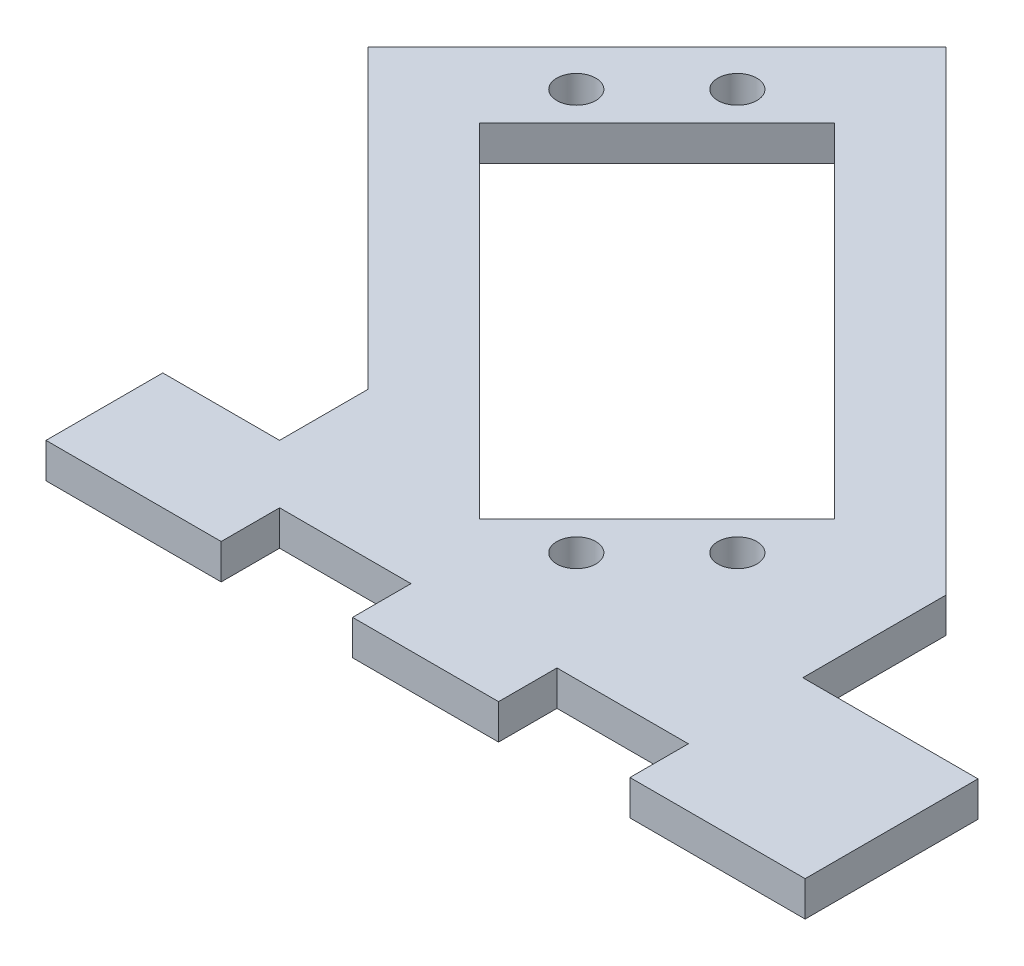
ISO-10303-21;
HEADER;
FILE_DESCRIPTION(('STEP AP214'),'2;1');
FILE_NAME('part.step','',(''),(''),'','','');
FILE_SCHEMA(('AUTOMOTIVE_DESIGN { 1 0 10303 214 1 1 1 1 }'));
ENDSEC;
DATA;
#1=APPLICATION_CONTEXT('core data for automotive mechanical design processes');
#2=APPLICATION_PROTOCOL_DEFINITION('international standard','automotive_design',2000,#1);
#3=PRODUCT_CONTEXT('',#1,'mechanical');
#4=PRODUCT('Part','Part','',(#3));
#5=PRODUCT_RELATED_PRODUCT_CATEGORY('part','',(#4));
#6=PRODUCT_DEFINITION_FORMATION('','',#4);
#7=PRODUCT_DEFINITION_CONTEXT('part definition',#1,'design');
#8=PRODUCT_DEFINITION('design','',#6,#7);
#9=PRODUCT_DEFINITION_SHAPE('','',#8);
#10=(LENGTH_UNIT() NAMED_UNIT(*) SI_UNIT(.MILLI.,.METRE.));
#11=(NAMED_UNIT(*) PLANE_ANGLE_UNIT() SI_UNIT($,.RADIAN.));
#12=(NAMED_UNIT(*) SI_UNIT($,.STERADIAN.) SOLID_ANGLE_UNIT());
#13=UNCERTAINTY_MEASURE_WITH_UNIT(LENGTH_MEASURE(1.E-05),#10,'distance_accuracy_value','');
#14=(GEOMETRIC_REPRESENTATION_CONTEXT(3) GLOBAL_UNCERTAINTY_ASSIGNED_CONTEXT((#13)) GLOBAL_UNIT_ASSIGNED_CONTEXT((#10,
#11,#12)) REPRESENTATION_CONTEXT('',''));
#15=CARTESIAN_POINT('',(0.,0.,0.));
#16=DIRECTION('',(0.,0.,1.));
#17=DIRECTION('',(1.,0.,0.));
#18=AXIS2_PLACEMENT_3D('',#15,#16,#17);
#19=CARTESIAN_POINT('',(0.,3.,0.));
#20=DIRECTION('',(0.,1.,0.));
#21=DIRECTION('',(0.,0.,1.));
#22=AXIS2_PLACEMENT_3D('',#19,#20,#21);
#23=PLANE('',#22);
#24=CARTESIAN_POINT('',(6.66448141268325,3.,-1.64402326625868));
#25=DIRECTION('',(0.,1.,0.));
#26=DIRECTION('',(0.,0.,1.));
#27=AXIS2_PLACEMENT_3D('',#24,#25,#26);
#28=CIRCLE('',#27,1.67019483414993);
#29=CARTESIAN_POINT('',(6.66448141268325,3.,0.0261715678912522));
#30=VERTEX_POINT('',#29);
#31=EDGE_CURVE('E755',#30,#30,#28,.T.);
#32=ORIENTED_EDGE('',*,*,#31,.F.);
#33=EDGE_LOOP('',(#32));
#34=FACE_BOUND('',#33,.T.);
#35=CARTESIAN_POINT('',(-20.8066170364141,3.,-42.9037039484938));
#36=DIRECTION('',(0.,1.,0.));
#37=DIRECTION('',(0.,0.,1.));
#38=AXIS2_PLACEMENT_3D('',#35,#36,#37);
#39=CIRCLE('',#38,1.67019483414992);
#40=CARTESIAN_POINT('',(-20.8066170364141,3.,-41.2335091143438));
#41=VERTEX_POINT('',#40);
#42=EDGE_CURVE('E224',#41,#41,#39,.T.);
#43=ORIENTED_EDGE('',*,*,#42,.F.);
#44=EDGE_LOOP('',(#43));
#45=FACE_BOUND('',#44,.T.);
#46=DIRECTION('',(-0.707106781186547,0.,-0.707106781186549));
#47=VECTOR('',#46,1.);
#48=CARTESIAN_POINT('',(-15.0260191002141,3.,-54.9775522372541));
#49=LINE('',#48,#47);
#50=CARTESIAN_POINT('',(25.6239808997858,3.,-14.3275522372541));
#51=VERTEX_POINT('',#50);
#52=CARTESIAN_POINT('',(-15.0260191002141,3.,-54.9775522372541));
#53=VERTEX_POINT('',#52);
#54=EDGE_CURVE('E240',#51,#53,#49,.T.);
#55=ORIENTED_EDGE('',*,*,#54,.T.);
#56=DIRECTION('',(-0.707106781186551,0.,0.707106781186544));
#57=VECTOR('',#56,1.);
#58=CARTESIAN_POINT('',(-39.7747564417434,3.,-30.228814895725));
#59=LINE('',#58,#57);
#60=CARTESIAN_POINT('',(-39.7747564417434,3.,-30.228814895725));
#61=VERTEX_POINT('',#60);
#62=EDGE_CURVE('E244',#53,#61,#59,.T.);
#63=ORIENTED_EDGE('',*,*,#62,.T.);
#64=DIRECTION('',(0.707106781186546,0.,0.707106781186548));
#65=VECTOR('',#64,1.);
#66=CARTESIAN_POINT('',(-14.3760191002142,3.,-4.8300775541958));
#67=LINE('',#66,#65);
#68=CARTESIAN_POINT('',(-14.3760191002142,3.,-4.8300775541958));
#69=VERTEX_POINT('',#68);
#70=EDGE_CURVE('E248',#61,#69,#67,.T.);
#71=ORIENTED_EDGE('',*,*,#70,.T.);
#72=DIRECTION('',(0.,0.,1.));
#73=VECTOR('',#72,1.);
#74=CARTESIAN_POINT('',(-14.3760191002142,3.,-4.8300775541958));
#75=LINE('',#74,#73);
#76=CARTESIAN_POINT('',(-14.3760191002142,3.,2.7224477627459));
#77=VERTEX_POINT('',#76);
#78=EDGE_CURVE('E251',#69,#77,#75,.T.);
#79=ORIENTED_EDGE('',*,*,#78,.T.);
#80=DIRECTION('',(-1.,0.,0.));
#81=VECTOR('',#80,1.);
#82=CARTESIAN_POINT('',(-14.3760191002142,3.,2.7224477627459));
#83=LINE('',#82,#81);
#84=CARTESIAN_POINT('',(-24.3760191002142,3.,2.7224477627459));
#85=VERTEX_POINT('',#84);
#86=EDGE_CURVE('E254',#77,#85,#83,.T.);
#87=ORIENTED_EDGE('',*,*,#86,.T.);
#88=DIRECTION('',(0.,0.,1.));
#89=VECTOR('',#88,1.);
#90=CARTESIAN_POINT('',(-24.3760191002142,3.,2.7224477627459));
#91=LINE('',#90,#89);
#92=CARTESIAN_POINT('',(-24.3760191002142,3.,12.7224477627459));
#93=VERTEX_POINT('',#92);
#94=EDGE_CURVE('E257',#85,#93,#91,.T.);
#95=ORIENTED_EDGE('',*,*,#94,.T.);
#96=DIRECTION('',(1.,0.,0.));
#97=VECTOR('',#96,1.);
#98=CARTESIAN_POINT('',(-24.3760191002142,3.,12.7224477627459));
#99=LINE('',#98,#97);
#100=CARTESIAN_POINT('',(-9.3760191002142,3.,12.7224477627459));
#101=VERTEX_POINT('',#100);
#102=EDGE_CURVE('E260',#93,#101,#99,.T.);
#103=ORIENTED_EDGE('',*,*,#102,.T.);
#104=DIRECTION('',(0.,0.,-1.));
#105=VECTOR('',#104,1.);
#106=CARTESIAN_POINT('',(-9.3760191002142,3.,12.7224477627459));
#107=LINE('',#106,#105);
#108=CARTESIAN_POINT('',(-9.3760191002142,3.,7.7224477627459));
#109=VERTEX_POINT('',#108);
#110=EDGE_CURVE('E263',#101,#109,#107,.T.);
#111=ORIENTED_EDGE('',*,*,#110,.T.);
#112=DIRECTION('',(1.,0.,0.));
#113=VECTOR('',#112,1.);
#114=CARTESIAN_POINT('',(-9.3760191002142,3.,7.7224477627459));
#115=LINE('',#114,#113);
#116=CARTESIAN_POINT('',(1.87398089978579,3.,7.7224477627459));
#117=VERTEX_POINT('',#116);
#118=EDGE_CURVE('E266',#109,#117,#115,.T.);
#119=ORIENTED_EDGE('',*,*,#118,.T.);
#120=DIRECTION('',(0.,0.,1.));
#121=VECTOR('',#120,1.);
#122=CARTESIAN_POINT('',(1.87398089978579,3.,7.7224477627459));
#123=LINE('',#122,#121);
#124=CARTESIAN_POINT('',(1.87398089978579,3.,12.7224477627459));
#125=VERTEX_POINT('',#124);
#126=EDGE_CURVE('E269',#117,#125,#123,.T.);
#127=ORIENTED_EDGE('',*,*,#126,.T.);
#128=DIRECTION('',(1.,0.,0.));
#129=VECTOR('',#128,1.);
#130=CARTESIAN_POINT('',(1.87398089978579,3.,12.7224477627459));
#131=LINE('',#130,#129);
#132=CARTESIAN_POINT('',(14.3739808997858,3.,12.7224477627459));
#133=VERTEX_POINT('',#132);
#134=EDGE_CURVE('E272',#125,#133,#131,.T.);
#135=ORIENTED_EDGE('',*,*,#134,.T.);
#136=DIRECTION('',(0.,0.,-1.));
#137=VECTOR('',#136,1.);
#138=CARTESIAN_POINT('',(14.3739808997858,3.,12.7224477627459));
#139=LINE('',#138,#137);
#140=CARTESIAN_POINT('',(14.3739808997858,3.,7.7224477627459));
#141=VERTEX_POINT('',#140);
#142=EDGE_CURVE('E275',#133,#141,#139,.T.);
#143=ORIENTED_EDGE('',*,*,#142,.T.);
#144=DIRECTION('',(1.,0.,0.));
#145=VECTOR('',#144,1.);
#146=CARTESIAN_POINT('',(14.3739808997858,3.,7.7224477627459));
#147=LINE('',#146,#145);
#148=CARTESIAN_POINT('',(25.6239808997858,3.,7.7224477627459));
#149=VERTEX_POINT('',#148);
#150=EDGE_CURVE('E278',#141,#149,#147,.T.);
#151=ORIENTED_EDGE('',*,*,#150,.T.);
#152=DIRECTION('',(0.,0.,1.));
#153=VECTOR('',#152,1.);
#154=CARTESIAN_POINT('',(25.6239808997858,3.,7.7224477627459));
#155=LINE('',#154,#153);
#156=CARTESIAN_POINT('',(25.6239808997858,3.,12.7224477627459));
#157=VERTEX_POINT('',#156);
#158=EDGE_CURVE('E281',#149,#157,#155,.T.);
#159=ORIENTED_EDGE('',*,*,#158,.T.);
#160=DIRECTION('',(1.,0.,0.));
#161=VECTOR('',#160,1.);
#162=CARTESIAN_POINT('',(25.6239808997858,3.,12.7224477627459));
#163=LINE('',#162,#161);
#164=CARTESIAN_POINT('',(40.6239808997858,3.,12.7224477627459));
#165=VERTEX_POINT('',#164);
#166=EDGE_CURVE('E284',#157,#165,#163,.T.);
#167=ORIENTED_EDGE('',*,*,#166,.T.);
#168=DIRECTION('',(0.,0.,-1.));
#169=VECTOR('',#168,1.);
#170=CARTESIAN_POINT('',(40.6239808997858,3.,12.7224477627459));
#171=LINE('',#170,#169);
#172=CARTESIAN_POINT('',(40.6239808997858,3.,-2.07755223725413));
#173=VERTEX_POINT('',#172);
#174=EDGE_CURVE('E287',#165,#173,#171,.T.);
#175=ORIENTED_EDGE('',*,*,#174,.T.);
#176=DIRECTION('',(-1.,0.,0.));
#177=VECTOR('',#176,1.);
#178=CARTESIAN_POINT('',(25.6239808997858,3.,-2.07755223725411));
#179=LINE('',#178,#177);
#180=CARTESIAN_POINT('',(25.6239808997858,3.,-2.07755223725411));
#181=VERTEX_POINT('',#180);
#182=EDGE_CURVE('E290',#173,#181,#179,.T.);
#183=ORIENTED_EDGE('',*,*,#182,.T.);
#184=DIRECTION('',(0.,0.,-1.));
#185=VECTOR('',#184,1.);
#186=CARTESIAN_POINT('',(25.6239808997858,3.,-14.3275522372541));
#187=LINE('',#186,#185);
#188=EDGE_CURVE('E293',#181,#51,#187,.T.);
#189=ORIENTED_EDGE('',*,*,#188,.T.);
#190=EDGE_LOOP('',(#55,#63,#71,#79,#87,#95,#103,#111,#119,#127,#135,#143,#151,#159,#167,#175,
#183,#189));
#191=FACE_BOUND('',#190,.T.);
#192=DIRECTION('',(0.707106781186549,0.,-0.707106781186546));
#193=VECTOR('',#192,1.);
#194=CARTESIAN_POINT('',(0.,3.,0.));
#195=LINE('',#194,#193);
#196=CARTESIAN_POINT('',(0.,3.,0.));
#197=VERTEX_POINT('',#196);
#198=CARTESIAN_POINT('',(15.2027957955108,3.,-15.2027957955108));
#199=VERTEX_POINT('',#198);
#200=EDGE_CURVE('E198',#197,#199,#195,.T.);
#201=ORIENTED_EDGE('',*,*,#200,.F.);
#202=DIRECTION('',(0.707106781186546,0.,0.707106781186549));
#203=VECTOR('',#202,1.);
#204=CARTESIAN_POINT('',(-29.3449314192418,3.,-29.3449314192419));
#205=LINE('',#204,#203);
#206=CARTESIAN_POINT('',(-29.3449314192418,3.,-29.3449314192419));
#207=VERTEX_POINT('',#206);
#208=EDGE_CURVE('E189',#207,#197,#205,.T.);
#209=ORIENTED_EDGE('',*,*,#208,.F.);
#210=DIRECTION('',(-0.707106781186552,0.,0.707106781186543));
#211=VECTOR('',#210,1.);
#212=CARTESIAN_POINT('',(-14.1421356237311,3.,-44.5477272147525));
#213=LINE('',#212,#211);
#214=CARTESIAN_POINT('',(-14.1421356237311,3.,-44.5477272147525));
#215=VERTEX_POINT('',#214);
#216=EDGE_CURVE('E216',#215,#207,#213,.T.);
#217=ORIENTED_EDGE('',*,*,#216,.F.);
#218=DIRECTION('',(-0.707106781186549,0.,-0.707106781186547));
#219=VECTOR('',#218,1.);
#220=CARTESIAN_POINT('',(15.2027957955108,3.,-15.2027957955108));
#221=LINE('',#220,#219);
#222=EDGE_CURVE('E212',#199,#215,#221,.T.);
#223=ORIENTED_EDGE('',*,*,#222,.F.);
#224=EDGE_LOOP('',(#201,#209,#217,#223));
#225=FACE_BOUND('',#224,.T.);
#226=CARTESIAN_POINT('',(-27.7009081529829,3.,-36.0094128319249));
#227=DIRECTION('',(0.,1.,0.));
#228=DIRECTION('',(0.,0.,-1.));
#229=AXIS2_PLACEMENT_3D('',#226,#227,#228);
#230=CIRCLE('',#229,1.67019483414993);
#231=CARTESIAN_POINT('',(-27.7009081529829,3.,-37.6796076660749));
#232=VERTEX_POINT('',#231);
#233=EDGE_CURVE('E763',#232,#232,#230,.T.);
#234=ORIENTED_EDGE('',*,*,#233,.F.);
#235=EDGE_LOOP('',(#234));
#236=FACE_BOUND('',#235,.T.);
#237=CARTESIAN_POINT('',(13.5587725292521,3.,-8.5383143828275));
#238=DIRECTION('',(0.,1.,0.));
#239=DIRECTION('',(0.,0.,-1.));
#240=AXIS2_PLACEMENT_3D('',#237,#238,#239);
#241=CIRCLE('',#240,1.67019483414992);
#242=CARTESIAN_POINT('',(13.5587725292521,3.,-10.2085092169774));
#243=VERTEX_POINT('',#242);
#244=EDGE_CURVE('E744',#243,#243,#241,.T.);
#245=ORIENTED_EDGE('',*,*,#244,.F.);
#246=EDGE_LOOP('',(#245));
#247=FACE_BOUND('',#246,.T.);
#248=ADVANCED_FACE('F39',(#34,#45,#191,#225,#236,#247),#23,.T.);
#249=CARTESIAN_POINT('',(0.,0.,0.));
#250=DIRECTION('',(0.,1.,0.));
#251=DIRECTION('',(0.,0.,1.));
#252=AXIS2_PLACEMENT_3D('',#249,#250,#251);
#253=PLANE('',#252);
#254=DIRECTION('',(-0.707106781186547,0.,-0.707106781186549));
#255=VECTOR('',#254,1.);
#256=CARTESIAN_POINT('',(-15.0260191002141,0.,-54.9775522372541));
#257=LINE('',#256,#255);
#258=CARTESIAN_POINT('',(25.6239808997858,0.,-14.3275522372541));
#259=VERTEX_POINT('',#258);
#260=CARTESIAN_POINT('',(-15.0260191002141,0.,-54.9775522372541));
#261=VERTEX_POINT('',#260);
#262=EDGE_CURVE('E207',#259,#261,#257,.T.);
#263=ORIENTED_EDGE('',*,*,#262,.F.);
#264=DIRECTION('',(0.,0.,-1.));
#265=VECTOR('',#264,1.);
#266=CARTESIAN_POINT('',(25.6239808997858,0.,-14.3275522372541));
#267=LINE('',#266,#265);
#268=CARTESIAN_POINT('',(25.6239808997858,0.,-2.07755223725411));
#269=VERTEX_POINT('',#268);
#270=EDGE_CURVE('E245',#269,#259,#267,.T.);
#271=ORIENTED_EDGE('',*,*,#270,.F.);
#272=DIRECTION('',(-1.,0.,0.));
#273=VECTOR('',#272,1.);
#274=CARTESIAN_POINT('',(25.6239808997858,0.,-2.07755223725411));
#275=LINE('',#274,#273);
#276=CARTESIAN_POINT('',(40.6239808997858,0.,-2.07755223725413));
#277=VERTEX_POINT('',#276);
#278=EDGE_CURVE('E345',#277,#269,#275,.T.);
#279=ORIENTED_EDGE('',*,*,#278,.F.);
#280=DIRECTION('',(0.,0.,-1.));
#281=VECTOR('',#280,1.);
#282=CARTESIAN_POINT('',(40.6239808997858,0.,12.7224477627459));
#283=LINE('',#282,#281);
#284=CARTESIAN_POINT('',(40.6239808997858,0.,12.7224477627459));
#285=VERTEX_POINT('',#284);
#286=EDGE_CURVE('E342',#285,#277,#283,.T.);
#287=ORIENTED_EDGE('',*,*,#286,.F.);
#288=DIRECTION('',(1.,0.,0.));
#289=VECTOR('',#288,1.);
#290=CARTESIAN_POINT('',(25.6239808997858,0.,12.7224477627459));
#291=LINE('',#290,#289);
#292=CARTESIAN_POINT('',(25.6239808997858,0.,12.7224477627459));
#293=VERTEX_POINT('',#292);
#294=EDGE_CURVE('E339',#293,#285,#291,.T.);
#295=ORIENTED_EDGE('',*,*,#294,.F.);
#296=DIRECTION('',(0.,0.,1.));
#297=VECTOR('',#296,1.);
#298=CARTESIAN_POINT('',(25.6239808997858,0.,7.7224477627459));
#299=LINE('',#298,#297);
#300=CARTESIAN_POINT('',(25.6239808997858,0.,7.7224477627459));
#301=VERTEX_POINT('',#300);
#302=EDGE_CURVE('E336',#301,#293,#299,.T.);
#303=ORIENTED_EDGE('',*,*,#302,.F.);
#304=DIRECTION('',(1.,0.,0.));
#305=VECTOR('',#304,1.);
#306=CARTESIAN_POINT('',(14.3739808997858,0.,7.7224477627459));
#307=LINE('',#306,#305);
#308=CARTESIAN_POINT('',(14.3739808997858,0.,7.7224477627459));
#309=VERTEX_POINT('',#308);
#310=EDGE_CURVE('E333',#309,#301,#307,.T.);
#311=ORIENTED_EDGE('',*,*,#310,.F.);
#312=DIRECTION('',(0.,0.,-1.));
#313=VECTOR('',#312,1.);
#314=CARTESIAN_POINT('',(14.3739808997858,0.,12.7224477627459));
#315=LINE('',#314,#313);
#316=CARTESIAN_POINT('',(14.3739808997858,0.,12.7224477627459));
#317=VERTEX_POINT('',#316);
#318=EDGE_CURVE('E330',#317,#309,#315,.T.);
#319=ORIENTED_EDGE('',*,*,#318,.F.);
#320=DIRECTION('',(1.,0.,0.));
#321=VECTOR('',#320,1.);
#322=CARTESIAN_POINT('',(1.87398089978579,0.,12.7224477627459));
#323=LINE('',#322,#321);
#324=CARTESIAN_POINT('',(1.87398089978579,0.,12.7224477627459));
#325=VERTEX_POINT('',#324);
#326=EDGE_CURVE('E327',#325,#317,#323,.T.);
#327=ORIENTED_EDGE('',*,*,#326,.F.);
#328=DIRECTION('',(0.,0.,1.));
#329=VECTOR('',#328,1.);
#330=CARTESIAN_POINT('',(1.87398089978579,0.,7.7224477627459));
#331=LINE('',#330,#329);
#332=CARTESIAN_POINT('',(1.87398089978579,0.,7.7224477627459));
#333=VERTEX_POINT('',#332);
#334=EDGE_CURVE('E324',#333,#325,#331,.T.);
#335=ORIENTED_EDGE('',*,*,#334,.F.);
#336=DIRECTION('',(1.,0.,0.));
#337=VECTOR('',#336,1.);
#338=CARTESIAN_POINT('',(-9.3760191002142,0.,7.7224477627459));
#339=LINE('',#338,#337);
#340=CARTESIAN_POINT('',(-9.3760191002142,0.,7.7224477627459));
#341=VERTEX_POINT('',#340);
#342=EDGE_CURVE('E321',#341,#333,#339,.T.);
#343=ORIENTED_EDGE('',*,*,#342,.F.);
#344=DIRECTION('',(0.,0.,-1.));
#345=VECTOR('',#344,1.);
#346=CARTESIAN_POINT('',(-9.3760191002142,0.,12.7224477627459));
#347=LINE('',#346,#345);
#348=CARTESIAN_POINT('',(-9.3760191002142,0.,12.7224477627459));
#349=VERTEX_POINT('',#348);
#350=EDGE_CURVE('E318',#349,#341,#347,.T.);
#351=ORIENTED_EDGE('',*,*,#350,.F.);
#352=DIRECTION('',(1.,0.,0.));
#353=VECTOR('',#352,1.);
#354=CARTESIAN_POINT('',(-24.3760191002142,0.,12.7224477627459));
#355=LINE('',#354,#353);
#356=CARTESIAN_POINT('',(-24.3760191002142,0.,12.7224477627459));
#357=VERTEX_POINT('',#356);
#358=EDGE_CURVE('E315',#357,#349,#355,.T.);
#359=ORIENTED_EDGE('',*,*,#358,.F.);
#360=DIRECTION('',(0.,0.,1.));
#361=VECTOR('',#360,1.);
#362=CARTESIAN_POINT('',(-24.3760191002142,0.,2.7224477627459));
#363=LINE('',#362,#361);
#364=CARTESIAN_POINT('',(-24.3760191002142,0.,2.7224477627459));
#365=VERTEX_POINT('',#364);
#366=EDGE_CURVE('E312',#365,#357,#363,.T.);
#367=ORIENTED_EDGE('',*,*,#366,.F.);
#368=DIRECTION('',(-1.,0.,0.));
#369=VECTOR('',#368,1.);
#370=CARTESIAN_POINT('',(-14.3760191002142,0.,2.7224477627459));
#371=LINE('',#370,#369);
#372=CARTESIAN_POINT('',(-14.3760191002142,0.,2.7224477627459));
#373=VERTEX_POINT('',#372);
#374=EDGE_CURVE('E309',#373,#365,#371,.T.);
#375=ORIENTED_EDGE('',*,*,#374,.F.);
#376=DIRECTION('',(0.,0.,1.));
#377=VECTOR('',#376,1.);
#378=CARTESIAN_POINT('',(-14.3760191002142,0.,-4.8300775541958));
#379=LINE('',#378,#377);
#380=CARTESIAN_POINT('',(-14.3760191002142,0.,-4.8300775541958));
#381=VERTEX_POINT('',#380);
#382=EDGE_CURVE('E306',#381,#373,#379,.T.);
#383=ORIENTED_EDGE('',*,*,#382,.F.);
#384=DIRECTION('',(0.707106781186546,0.,0.707106781186548));
#385=VECTOR('',#384,1.);
#386=CARTESIAN_POINT('',(-14.3760191002142,0.,-4.8300775541958));
#387=LINE('',#386,#385);
#388=CARTESIAN_POINT('',(-39.7747564417434,0.,-30.228814895725));
#389=VERTEX_POINT('',#388);
#390=EDGE_CURVE('E303',#389,#381,#387,.T.);
#391=ORIENTED_EDGE('',*,*,#390,.F.);
#392=DIRECTION('',(-0.707106781186551,0.,0.707106781186544));
#393=VECTOR('',#392,1.);
#394=CARTESIAN_POINT('',(-39.7747564417434,0.,-30.228814895725));
#395=LINE('',#394,#393);
#396=EDGE_CURVE('E300',#261,#389,#395,.T.);
#397=ORIENTED_EDGE('',*,*,#396,.F.);
#398=EDGE_LOOP('',(#263,#271,#279,#287,#295,#303,#311,#319,#327,#335,#343,#351,#359,#367,#375,
#383,#391,#397));
#399=FACE_BOUND('',#398,.T.);
#400=DIRECTION('',(0.707106781186546,0.,0.707106781186549));
#401=VECTOR('',#400,1.);
#402=CARTESIAN_POINT('',(-29.3449314192418,0.,-29.3449314192419));
#403=LINE('',#402,#401);
#404=CARTESIAN_POINT('',(-29.3449314192418,0.,-29.3449314192419));
#405=VERTEX_POINT('',#404);
#406=CARTESIAN_POINT('',(0.,0.,0.));
#407=VERTEX_POINT('',#406);
#408=EDGE_CURVE('E63',#405,#407,#403,.T.);
#409=ORIENTED_EDGE('',*,*,#408,.T.);
#410=DIRECTION('',(0.707106781186549,0.,-0.707106781186546));
#411=VECTOR('',#410,1.);
#412=CARTESIAN_POINT('',(0.,0.,0.));
#413=LINE('',#412,#411);
#414=CARTESIAN_POINT('',(15.2027957955108,0.,-15.2027957955108));
#415=VERTEX_POINT('',#414);
#416=EDGE_CURVE('E205',#407,#415,#413,.T.);
#417=ORIENTED_EDGE('',*,*,#416,.T.);
#418=DIRECTION('',(-0.707106781186549,0.,-0.707106781186547));
#419=VECTOR('',#418,1.);
#420=CARTESIAN_POINT('',(15.2027957955108,0.,-15.2027957955108));
#421=LINE('',#420,#419);
#422=CARTESIAN_POINT('',(-14.1421356237311,0.,-44.5477272147525));
#423=VERTEX_POINT('',#422);
#424=EDGE_CURVE('E227',#415,#423,#421,.T.);
#425=ORIENTED_EDGE('',*,*,#424,.T.);
#426=DIRECTION('',(-0.707106781186552,0.,0.707106781186543));
#427=VECTOR('',#426,1.);
#428=CARTESIAN_POINT('',(-14.1421356237311,0.,-44.5477272147525));
#429=LINE('',#428,#427);
#430=EDGE_CURVE('E199',#423,#405,#429,.T.);
#431=ORIENTED_EDGE('',*,*,#430,.T.);
#432=EDGE_LOOP('',(#409,#417,#425,#431));
#433=FACE_BOUND('',#432,.T.);
#434=CARTESIAN_POINT('',(-20.8066170364141,0.,-42.9037039484938));
#435=DIRECTION('',(0.,1.,0.));
#436=DIRECTION('',(0.,0.,1.));
#437=AXIS2_PLACEMENT_3D('',#434,#435,#436);
#438=CIRCLE('',#437,1.67019483414992);
#439=CARTESIAN_POINT('',(-20.8066170364141,0.,-41.2335091143438));
#440=VERTEX_POINT('',#439);
#441=EDGE_CURVE('E767',#440,#440,#438,.T.);
#442=ORIENTED_EDGE('',*,*,#441,.T.);
#443=EDGE_LOOP('',(#442));
#444=FACE_BOUND('',#443,.T.);
#445=CARTESIAN_POINT('',(-27.7009081529829,0.,-36.0094128319249));
#446=DIRECTION('',(0.,1.,0.));
#447=DIRECTION('',(0.,0.,-1.));
#448=AXIS2_PLACEMENT_3D('',#445,#446,#447);
#449=CIRCLE('',#448,1.67019483414993);
#450=CARTESIAN_POINT('',(-27.7009081529829,0.,-37.6796076660749));
#451=VERTEX_POINT('',#450);
#452=EDGE_CURVE('E759',#451,#451,#449,.T.);
#453=ORIENTED_EDGE('',*,*,#452,.T.);
#454=EDGE_LOOP('',(#453));
#455=FACE_BOUND('',#454,.T.);
#456=CARTESIAN_POINT('',(6.66448141268325,0.,-1.64402326625868));
#457=DIRECTION('',(0.,1.,0.));
#458=DIRECTION('',(0.,0.,1.));
#459=AXIS2_PLACEMENT_3D('',#456,#457,#458);
#460=CIRCLE('',#459,1.67019483414993);
#461=CARTESIAN_POINT('',(6.66448141268325,0.,0.0261715678912522));
#462=VERTEX_POINT('',#461);
#463=EDGE_CURVE('E752',#462,#462,#460,.T.);
#464=ORIENTED_EDGE('',*,*,#463,.T.);
#465=EDGE_LOOP('',(#464));
#466=FACE_BOUND('',#465,.T.);
#467=CARTESIAN_POINT('',(13.5587725292521,0.,-8.5383143828275));
#468=DIRECTION('',(0.,1.,0.));
#469=DIRECTION('',(0.,0.,-1.));
#470=AXIS2_PLACEMENT_3D('',#467,#468,#469);
#471=CIRCLE('',#470,1.67019483414992);
#472=CARTESIAN_POINT('',(13.5587725292521,0.,-10.2085092169774));
#473=VERTEX_POINT('',#472);
#474=EDGE_CURVE('E747',#473,#473,#471,.T.);
#475=ORIENTED_EDGE('',*,*,#474,.T.);
#476=EDGE_LOOP('',(#475));
#477=FACE_BOUND('',#476,.T.);
#478=ADVANCED_FACE('F424',(#399,#433,#444,#455,#466,#477),#253,.F.);
#479=CARTESIAN_POINT('',(-15.0260191002141,3.,-54.9775522372541));
#480=DIRECTION('',(-0.707106781186548,0.,0.707106781186546));
#481=DIRECTION('',(0.707106781186547,0.,0.707106781186549));
#482=AXIS2_PLACEMENT_3D('',#479,#480,#481);
#483=PLANE('',#482);
#484=ORIENTED_EDGE('',*,*,#262,.T.);
#485=DIRECTION('',(0.,-1.,0.));
#486=VECTOR('',#485,1.);
#487=CARTESIAN_POINT('',(-15.0260191002141,3.,-54.9775522372541));
#488=LINE('',#487,#486);
#489=EDGE_CURVE('E11',#53,#261,#488,.T.);
#490=ORIENTED_EDGE('',*,*,#489,.F.);
#491=ORIENTED_EDGE('',*,*,#54,.F.);
#492=DIRECTION('',(0.,-1.,0.));
#493=VECTOR('',#492,1.);
#494=CARTESIAN_POINT('',(25.6239808997858,3.,-14.3275522372541));
#495=LINE('',#494,#493);
#496=EDGE_CURVE('E296',#51,#259,#495,.T.);
#497=ORIENTED_EDGE('',*,*,#496,.T.);
#498=EDGE_LOOP('',(#484,#490,#491,#497));
#499=FACE_BOUND('',#498,.T.);
#500=ADVANCED_FACE('F41',(#499),#483,.F.);
#501=CARTESIAN_POINT('',(-39.7747564417434,3.,-30.228814895725));
#502=DIRECTION('',(0.707106781186544,0.,0.707106781186551));
#503=DIRECTION('',(0.707106781186551,0.,-0.707106781186544));
#504=AXIS2_PLACEMENT_3D('',#501,#502,#503);
#505=PLANE('',#504);
#506=ORIENTED_EDGE('',*,*,#396,.T.);
#507=DIRECTION('',(0.,-1.,0.));
#508=VECTOR('',#507,1.);
#509=CARTESIAN_POINT('',(-39.7747564417434,3.,-30.228814895725));
#510=LINE('',#509,#508);
#511=EDGE_CURVE('E48',#61,#389,#510,.T.);
#512=ORIENTED_EDGE('',*,*,#511,.F.);
#513=ORIENTED_EDGE('',*,*,#62,.F.);
#514=ORIENTED_EDGE('',*,*,#489,.T.);
#515=EDGE_LOOP('',(#506,#512,#513,#514));
#516=FACE_BOUND('',#515,.T.);
#517=ADVANCED_FACE('F441',(#516),#505,.F.);
#518=CARTESIAN_POINT('',(-14.3760191002142,3.,-4.8300775541958));
#519=DIRECTION('',(0.707106781186549,0.,-0.707106781186547));
#520=DIRECTION('',(-0.707106781186547,0.,-0.707106781186549));
#521=AXIS2_PLACEMENT_3D('',#518,#519,#520);
#522=PLANE('',#521);
#523=ORIENTED_EDGE('',*,*,#390,.T.);
#524=DIRECTION('',(0.,-1.,0.));
#525=VECTOR('',#524,1.);
#526=CARTESIAN_POINT('',(-14.3760191002142,3.,-4.8300775541958));
#527=LINE('',#526,#525);
#528=EDGE_CURVE('E409',#69,#381,#527,.T.);
#529=ORIENTED_EDGE('',*,*,#528,.F.);
#530=ORIENTED_EDGE('',*,*,#70,.F.);
#531=ORIENTED_EDGE('',*,*,#511,.T.);
#532=EDGE_LOOP('',(#523,#529,#530,#531));
#533=FACE_BOUND('',#532,.T.);
#534=ADVANCED_FACE('F418',(#533),#522,.F.);
#535=CARTESIAN_POINT('',(-14.3760191002142,3.,-4.8300775541958));
#536=DIRECTION('',(1.,0.,0.));
#537=DIRECTION('',(0.,0.,-1.));
#538=AXIS2_PLACEMENT_3D('',#535,#536,#537);
#539=PLANE('',#538);
#540=ORIENTED_EDGE('',*,*,#382,.T.);
#541=DIRECTION('',(0.,-1.,0.));
#542=VECTOR('',#541,1.);
#543=CARTESIAN_POINT('',(-14.3760191002142,3.,2.7224477627459));
#544=LINE('',#543,#542);
#545=EDGE_CURVE('E405',#77,#373,#544,.T.);
#546=ORIENTED_EDGE('',*,*,#545,.F.);
#547=ORIENTED_EDGE('',*,*,#78,.F.);
#548=ORIENTED_EDGE('',*,*,#528,.T.);
#549=EDGE_LOOP('',(#540,#546,#547,#548));
#550=FACE_BOUND('',#549,.T.);
#551=ADVANCED_FACE('F430',(#550),#539,.F.);
#552=CARTESIAN_POINT('',(-14.3760191002142,3.,2.7224477627459));
#553=DIRECTION('',(0.,0.,1.));
#554=DIRECTION('',(1.,0.,0.));
#555=AXIS2_PLACEMENT_3D('',#552,#553,#554);
#556=PLANE('',#555);
#557=ORIENTED_EDGE('',*,*,#374,.T.);
#558=DIRECTION('',(0.,-1.,0.));
#559=VECTOR('',#558,1.);
#560=CARTESIAN_POINT('',(-24.3760191002142,3.,2.7224477627459));
#561=LINE('',#560,#559);
#562=EDGE_CURVE('E401',#85,#365,#561,.T.);
#563=ORIENTED_EDGE('',*,*,#562,.F.);
#564=ORIENTED_EDGE('',*,*,#86,.F.);
#565=ORIENTED_EDGE('',*,*,#545,.T.);
#566=EDGE_LOOP('',(#557,#563,#564,#565));
#567=FACE_BOUND('',#566,.T.);
#568=ADVANCED_FACE('F434',(#567),#556,.F.);
#569=CARTESIAN_POINT('',(-24.3760191002142,3.,2.7224477627459));
#570=DIRECTION('',(1.,0.,0.));
#571=DIRECTION('',(0.,0.,-1.));
#572=AXIS2_PLACEMENT_3D('',#569,#570,#571);
#573=PLANE('',#572);
#574=ORIENTED_EDGE('',*,*,#366,.T.);
#575=DIRECTION('',(0.,-1.,0.));
#576=VECTOR('',#575,1.);
#577=CARTESIAN_POINT('',(-24.3760191002142,3.,12.7224477627459));
#578=LINE('',#577,#576);
#579=EDGE_CURVE('E397',#93,#357,#578,.T.);
#580=ORIENTED_EDGE('',*,*,#579,.F.);
#581=ORIENTED_EDGE('',*,*,#94,.F.);
#582=ORIENTED_EDGE('',*,*,#562,.T.);
#583=EDGE_LOOP('',(#574,#580,#581,#582));
#584=FACE_BOUND('',#583,.T.);
#585=ADVANCED_FACE('F504',(#584),#573,.F.);
#586=CARTESIAN_POINT('',(-24.3760191002142,3.,12.7224477627459));
#587=DIRECTION('',(0.,0.,-1.));
#588=DIRECTION('',(-1.,0.,0.));
#589=AXIS2_PLACEMENT_3D('',#586,#587,#588);
#590=PLANE('',#589);
#591=ORIENTED_EDGE('',*,*,#358,.T.);
#592=DIRECTION('',(0.,-1.,0.));
#593=VECTOR('',#592,1.);
#594=CARTESIAN_POINT('',(-9.3760191002142,3.,12.7224477627459));
#595=LINE('',#594,#593);
#596=EDGE_CURVE('E393',#101,#349,#595,.T.);
#597=ORIENTED_EDGE('',*,*,#596,.F.);
#598=ORIENTED_EDGE('',*,*,#102,.F.);
#599=ORIENTED_EDGE('',*,*,#579,.T.);
#600=EDGE_LOOP('',(#591,#597,#598,#599));
#601=FACE_BOUND('',#600,.T.);
#602=ADVANCED_FACE('F502',(#601),#590,.F.);
#603=CARTESIAN_POINT('',(-9.3760191002142,3.,12.7224477627459));
#604=DIRECTION('',(-1.,0.,0.));
#605=DIRECTION('',(0.,0.,1.));
#606=AXIS2_PLACEMENT_3D('',#603,#604,#605);
#607=PLANE('',#606);
#608=ORIENTED_EDGE('',*,*,#350,.T.);
#609=DIRECTION('',(0.,-1.,0.));
#610=VECTOR('',#609,1.);
#611=CARTESIAN_POINT('',(-9.3760191002142,3.,7.7224477627459));
#612=LINE('',#611,#610);
#613=EDGE_CURVE('E389',#109,#341,#612,.T.);
#614=ORIENTED_EDGE('',*,*,#613,.F.);
#615=ORIENTED_EDGE('',*,*,#110,.F.);
#616=ORIENTED_EDGE('',*,*,#596,.T.);
#617=EDGE_LOOP('',(#608,#614,#615,#616));
#618=FACE_BOUND('',#617,.T.);
#619=ADVANCED_FACE('F498',(#618),#607,.F.);
#620=CARTESIAN_POINT('',(-9.3760191002142,3.,7.7224477627459));
#621=DIRECTION('',(0.,0.,-1.));
#622=DIRECTION('',(-1.,0.,0.));
#623=AXIS2_PLACEMENT_3D('',#620,#621,#622);
#624=PLANE('',#623);
#625=ORIENTED_EDGE('',*,*,#342,.T.);
#626=DIRECTION('',(0.,-1.,0.));
#627=VECTOR('',#626,1.);
#628=CARTESIAN_POINT('',(1.87398089978579,3.,7.7224477627459));
#629=LINE('',#628,#627);
#630=EDGE_CURVE('E385',#117,#333,#629,.T.);
#631=ORIENTED_EDGE('',*,*,#630,.F.);
#632=ORIENTED_EDGE('',*,*,#118,.F.);
#633=ORIENTED_EDGE('',*,*,#613,.T.);
#634=EDGE_LOOP('',(#625,#631,#632,#633));
#635=FACE_BOUND('',#634,.T.);
#636=ADVANCED_FACE('F493',(#635),#624,.F.);
#637=CARTESIAN_POINT('',(1.87398089978579,3.,7.7224477627459));
#638=DIRECTION('',(1.,0.,0.));
#639=DIRECTION('',(0.,0.,-1.));
#640=AXIS2_PLACEMENT_3D('',#637,#638,#639);
#641=PLANE('',#640);
#642=ORIENTED_EDGE('',*,*,#334,.T.);
#643=DIRECTION('',(0.,-1.,0.));
#644=VECTOR('',#643,1.);
#645=CARTESIAN_POINT('',(1.87398089978579,3.,12.7224477627459));
#646=LINE('',#645,#644);
#647=EDGE_CURVE('E381',#125,#325,#646,.T.);
#648=ORIENTED_EDGE('',*,*,#647,.F.);
#649=ORIENTED_EDGE('',*,*,#126,.F.);
#650=ORIENTED_EDGE('',*,*,#630,.T.);
#651=EDGE_LOOP('',(#642,#648,#649,#650));
#652=FACE_BOUND('',#651,.T.);
#653=ADVANCED_FACE('F487',(#652),#641,.F.);
#654=CARTESIAN_POINT('',(1.87398089978579,3.,12.7224477627459));
#655=DIRECTION('',(0.,0.,-1.));
#656=DIRECTION('',(-1.,0.,0.));
#657=AXIS2_PLACEMENT_3D('',#654,#655,#656);
#658=PLANE('',#657);
#659=ORIENTED_EDGE('',*,*,#326,.T.);
#660=DIRECTION('',(0.,-1.,0.));
#661=VECTOR('',#660,1.);
#662=CARTESIAN_POINT('',(14.3739808997858,3.,12.7224477627459));
#663=LINE('',#662,#661);
#664=EDGE_CURVE('E377',#133,#317,#663,.T.);
#665=ORIENTED_EDGE('',*,*,#664,.F.);
#666=ORIENTED_EDGE('',*,*,#134,.F.);
#667=ORIENTED_EDGE('',*,*,#647,.T.);
#668=EDGE_LOOP('',(#659,#665,#666,#667));
#669=FACE_BOUND('',#668,.T.);
#670=ADVANCED_FACE('F483',(#669),#658,.F.);
#671=CARTESIAN_POINT('',(14.3739808997858,3.,12.7224477627459));
#672=DIRECTION('',(-1.,0.,0.));
#673=DIRECTION('',(0.,0.,1.));
#674=AXIS2_PLACEMENT_3D('',#671,#672,#673);
#675=PLANE('',#674);
#676=ORIENTED_EDGE('',*,*,#318,.T.);
#677=DIRECTION('',(0.,-1.,0.));
#678=VECTOR('',#677,1.);
#679=CARTESIAN_POINT('',(14.3739808997858,3.,7.7224477627459));
#680=LINE('',#679,#678);
#681=EDGE_CURVE('E373',#141,#309,#680,.T.);
#682=ORIENTED_EDGE('',*,*,#681,.F.);
#683=ORIENTED_EDGE('',*,*,#142,.F.);
#684=ORIENTED_EDGE('',*,*,#664,.T.);
#685=EDGE_LOOP('',(#676,#682,#683,#684));
#686=FACE_BOUND('',#685,.T.);
#687=ADVANCED_FACE('F478',(#686),#675,.F.);
#688=CARTESIAN_POINT('',(14.3739808997858,3.,7.7224477627459));
#689=DIRECTION('',(0.,0.,-1.));
#690=DIRECTION('',(-1.,0.,0.));
#691=AXIS2_PLACEMENT_3D('',#688,#689,#690);
#692=PLANE('',#691);
#693=ORIENTED_EDGE('',*,*,#310,.T.);
#694=DIRECTION('',(0.,-1.,0.));
#695=VECTOR('',#694,1.);
#696=CARTESIAN_POINT('',(25.6239808997858,3.,7.7224477627459));
#697=LINE('',#696,#695);
#698=EDGE_CURVE('E369',#149,#301,#697,.T.);
#699=ORIENTED_EDGE('',*,*,#698,.F.);
#700=ORIENTED_EDGE('',*,*,#150,.F.);
#701=ORIENTED_EDGE('',*,*,#681,.T.);
#702=EDGE_LOOP('',(#693,#699,#700,#701));
#703=FACE_BOUND('',#702,.T.);
#704=ADVANCED_FACE('F472',(#703),#692,.F.);
#705=CARTESIAN_POINT('',(25.6239808997858,3.,7.7224477627459));
#706=DIRECTION('',(1.,0.,0.));
#707=DIRECTION('',(0.,0.,-1.));
#708=AXIS2_PLACEMENT_3D('',#705,#706,#707);
#709=PLANE('',#708);
#710=ORIENTED_EDGE('',*,*,#302,.T.);
#711=DIRECTION('',(0.,-1.,0.));
#712=VECTOR('',#711,1.);
#713=CARTESIAN_POINT('',(25.6239808997858,3.,12.7224477627459));
#714=LINE('',#713,#712);
#715=EDGE_CURVE('E365',#157,#293,#714,.T.);
#716=ORIENTED_EDGE('',*,*,#715,.F.);
#717=ORIENTED_EDGE('',*,*,#158,.F.);
#718=ORIENTED_EDGE('',*,*,#698,.T.);
#719=EDGE_LOOP('',(#710,#716,#717,#718));
#720=FACE_BOUND('',#719,.T.);
#721=ADVANCED_FACE('F468',(#720),#709,.F.);
#722=CARTESIAN_POINT('',(25.6239808997858,3.,12.7224477627459));
#723=DIRECTION('',(0.,0.,-1.));
#724=DIRECTION('',(-1.,0.,0.));
#725=AXIS2_PLACEMENT_3D('',#722,#723,#724);
#726=PLANE('',#725);
#727=ORIENTED_EDGE('',*,*,#294,.T.);
#728=DIRECTION('',(0.,-1.,0.));
#729=VECTOR('',#728,1.);
#730=CARTESIAN_POINT('',(40.6239808997858,3.,12.7224477627459));
#731=LINE('',#730,#729);
#732=EDGE_CURVE('E361',#165,#285,#731,.T.);
#733=ORIENTED_EDGE('',*,*,#732,.F.);
#734=ORIENTED_EDGE('',*,*,#166,.F.);
#735=ORIENTED_EDGE('',*,*,#715,.T.);
#736=EDGE_LOOP('',(#727,#733,#734,#735));
#737=FACE_BOUND('',#736,.T.);
#738=ADVANCED_FACE('F463',(#737),#726,.F.);
#739=CARTESIAN_POINT('',(40.6239808997858,3.,12.7224477627459));
#740=DIRECTION('',(-1.,0.,0.));
#741=DIRECTION('',(0.,0.,1.));
#742=AXIS2_PLACEMENT_3D('',#739,#740,#741);
#743=PLANE('',#742);
#744=ORIENTED_EDGE('',*,*,#286,.T.);
#745=DIRECTION('',(0.,-1.,0.));
#746=VECTOR('',#745,1.);
#747=CARTESIAN_POINT('',(40.6239808997858,3.,-2.07755223725413));
#748=LINE('',#747,#746);
#749=EDGE_CURVE('E357',#173,#277,#748,.T.);
#750=ORIENTED_EDGE('',*,*,#749,.F.);
#751=ORIENTED_EDGE('',*,*,#174,.F.);
#752=ORIENTED_EDGE('',*,*,#732,.T.);
#753=EDGE_LOOP('',(#744,#750,#751,#752));
#754=FACE_BOUND('',#753,.T.);
#755=ADVANCED_FACE('F457',(#754),#743,.F.);
#756=CARTESIAN_POINT('',(25.6239808997858,3.,-2.07755223725411));
#757=DIRECTION('',(0.,0.,1.));
#758=DIRECTION('',(1.,0.,0.));
#759=AXIS2_PLACEMENT_3D('',#756,#757,#758);
#760=PLANE('',#759);
#761=ORIENTED_EDGE('',*,*,#278,.T.);
#762=DIRECTION('',(0.,-1.,0.));
#763=VECTOR('',#762,1.);
#764=CARTESIAN_POINT('',(25.6239808997858,3.,-2.07755223725411));
#765=LINE('',#764,#763);
#766=EDGE_CURVE('E353',#181,#269,#765,.T.);
#767=ORIENTED_EDGE('',*,*,#766,.F.);
#768=ORIENTED_EDGE('',*,*,#182,.F.);
#769=ORIENTED_EDGE('',*,*,#749,.T.);
#770=EDGE_LOOP('',(#761,#767,#768,#769));
#771=FACE_BOUND('',#770,.T.);
#772=ADVANCED_FACE('F453',(#771),#760,.F.);
#773=CARTESIAN_POINT('',(25.6239808997858,3.,-14.3275522372541));
#774=DIRECTION('',(-1.,0.,0.));
#775=DIRECTION('',(0.,0.,1.));
#776=AXIS2_PLACEMENT_3D('',#773,#774,#775);
#777=PLANE('',#776);
#778=ORIENTED_EDGE('',*,*,#270,.T.);
#779=ORIENTED_EDGE('',*,*,#496,.F.);
#780=ORIENTED_EDGE('',*,*,#188,.F.);
#781=ORIENTED_EDGE('',*,*,#766,.T.);
#782=EDGE_LOOP('',(#778,#779,#780,#781));
#783=FACE_BOUND('',#782,.T.);
#784=ADVANCED_FACE('F448',(#783),#777,.F.);
#785=CARTESIAN_POINT('',(-29.3449314192418,3.,-29.3449314192419));
#786=DIRECTION('',(0.707106781186548,0.,-0.707106781186546));
#787=DIRECTION('',(-0.707106781186546,0.,-0.707106781186549));
#788=AXIS2_PLACEMENT_3D('',#785,#786,#787);
#789=PLANE('',#788);
#790=ORIENTED_EDGE('',*,*,#408,.F.);
#791=DIRECTION('',(0.,-1.,0.));
#792=VECTOR('',#791,1.);
#793=CARTESIAN_POINT('',(-29.3449314192418,3.,-29.3449314192419));
#794=LINE('',#793,#792);
#795=EDGE_CURVE('E193',#207,#405,#794,.T.);
#796=ORIENTED_EDGE('',*,*,#795,.F.);
#797=ORIENTED_EDGE('',*,*,#208,.T.);
#798=DIRECTION('',(0.,-1.,0.));
#799=VECTOR('',#798,1.);
#800=CARTESIAN_POINT('',(0.,3.,0.));
#801=LINE('',#800,#799);
#802=EDGE_CURVE('E192',#197,#407,#801,.T.);
#803=ORIENTED_EDGE('',*,*,#802,.T.);
#804=EDGE_LOOP('',(#790,#796,#797,#803));
#805=FACE_BOUND('',#804,.T.);
#806=ADVANCED_FACE('F191',(#805),#789,.T.);
#807=CARTESIAN_POINT('',(0.,3.,0.));
#808=DIRECTION('',(-0.707106781186546,0.,-0.707106781186548));
#809=DIRECTION('',(-0.707106781186549,0.,0.707106781186546));
#810=AXIS2_PLACEMENT_3D('',#807,#808,#809);
#811=PLANE('',#810);
#812=ORIENTED_EDGE('',*,*,#416,.F.);
#813=ORIENTED_EDGE('',*,*,#802,.F.);
#814=ORIENTED_EDGE('',*,*,#200,.T.);
#815=DIRECTION('',(0.,-1.,0.));
#816=VECTOR('',#815,1.);
#817=CARTESIAN_POINT('',(15.2027957955108,3.,-15.2027957955108));
#818=LINE('',#817,#816);
#819=EDGE_CURVE('E208',#199,#415,#818,.T.);
#820=ORIENTED_EDGE('',*,*,#819,.T.);
#821=EDGE_LOOP('',(#812,#813,#814,#820));
#822=FACE_BOUND('',#821,.T.);
#823=ADVANCED_FACE('F202',(#822),#811,.T.);
#824=CARTESIAN_POINT('',(15.2027957955108,3.,-15.2027957955108));
#825=DIRECTION('',(-0.707106781186546,0.,0.707106781186548));
#826=DIRECTION('',(0.707106781186549,0.,0.707106781186547));
#827=AXIS2_PLACEMENT_3D('',#824,#825,#826);
#828=PLANE('',#827);
#829=ORIENTED_EDGE('',*,*,#424,.F.);
#830=ORIENTED_EDGE('',*,*,#819,.F.);
#831=ORIENTED_EDGE('',*,*,#222,.T.);
#832=DIRECTION('',(0.,-1.,0.));
#833=VECTOR('',#832,1.);
#834=CARTESIAN_POINT('',(-14.1421356237311,3.,-44.5477272147525));
#835=LINE('',#834,#833);
#836=EDGE_CURVE('E55',#215,#423,#835,.T.);
#837=ORIENTED_EDGE('',*,*,#836,.T.);
#838=EDGE_LOOP('',(#829,#830,#831,#837));
#839=FACE_BOUND('',#838,.T.);
#840=ADVANCED_FACE('F601',(#839),#828,.T.);
#841=CARTESIAN_POINT('',(-14.1421356237311,3.,-44.5477272147525));
#842=DIRECTION('',(0.707106781186543,0.,0.707106781186552));
#843=DIRECTION('',(0.707106781186552,0.,-0.707106781186543));
#844=AXIS2_PLACEMENT_3D('',#841,#842,#843);
#845=PLANE('',#844);
#846=ORIENTED_EDGE('',*,*,#430,.F.);
#847=ORIENTED_EDGE('',*,*,#836,.F.);
#848=ORIENTED_EDGE('',*,*,#216,.T.);
#849=ORIENTED_EDGE('',*,*,#795,.T.);
#850=EDGE_LOOP('',(#846,#847,#848,#849));
#851=FACE_BOUND('',#850,.T.);
#852=ADVANCED_FACE('F607',(#851),#845,.T.);
#853=CARTESIAN_POINT('',(-20.8066170364141,3.,-42.9037039484938));
#854=DIRECTION('',(0.,-1.,0.));
#855=DIRECTION('',(0.,0.,-1.));
#856=AXIS2_PLACEMENT_3D('',#853,#854,#855);
#857=CYLINDRICAL_SURFACE('',#856,1.67019483414992);
#858=ORIENTED_EDGE('',*,*,#42,.T.);
#859=EDGE_LOOP('',(#858));
#860=FACE_BOUND('',#859,.T.);
#861=ORIENTED_EDGE('',*,*,#441,.F.);
#862=EDGE_LOOP('',(#861));
#863=FACE_BOUND('',#862,.T.);
#864=ADVANCED_FACE('F615',(#860,#863),#857,.F.);
#865=CARTESIAN_POINT('',(-27.7009081529829,3.,-36.0094128319249));
#866=DIRECTION('',(0.,-1.,0.));
#867=DIRECTION('',(0.,0.,-1.));
#868=AXIS2_PLACEMENT_3D('',#865,#866,#867);
#869=CYLINDRICAL_SURFACE('',#868,1.67019483414993);
#870=ORIENTED_EDGE('',*,*,#233,.T.);
#871=EDGE_LOOP('',(#870));
#872=FACE_BOUND('',#871,.T.);
#873=ORIENTED_EDGE('',*,*,#452,.F.);
#874=EDGE_LOOP('',(#873));
#875=FACE_BOUND('',#874,.T.);
#876=ADVANCED_FACE('F622',(#872,#875),#869,.F.);
#877=CARTESIAN_POINT('',(6.66448141268325,3.,-1.64402326625868));
#878=DIRECTION('',(0.,-1.,0.));
#879=DIRECTION('',(0.,0.,-1.));
#880=AXIS2_PLACEMENT_3D('',#877,#878,#879);
#881=CYLINDRICAL_SURFACE('',#880,1.67019483414993);
#882=ORIENTED_EDGE('',*,*,#31,.T.);
#883=EDGE_LOOP('',(#882));
#884=FACE_BOUND('',#883,.T.);
#885=ORIENTED_EDGE('',*,*,#463,.F.);
#886=EDGE_LOOP('',(#885));
#887=FACE_BOUND('',#886,.T.);
#888=ADVANCED_FACE('F630',(#884,#887),#881,.F.);
#889=CARTESIAN_POINT('',(13.5587725292521,3.,-8.5383143828275));
#890=DIRECTION('',(0.,-1.,0.));
#891=DIRECTION('',(0.,0.,-1.));
#892=AXIS2_PLACEMENT_3D('',#889,#890,#891);
#893=CYLINDRICAL_SURFACE('',#892,1.67019483414992);
#894=ORIENTED_EDGE('',*,*,#244,.T.);
#895=EDGE_LOOP('',(#894));
#896=FACE_BOUND('',#895,.T.);
#897=ORIENTED_EDGE('',*,*,#474,.F.);
#898=EDGE_LOOP('',(#897));
#899=FACE_BOUND('',#898,.T.);
#900=ADVANCED_FACE('F638',(#896,#899),#893,.F.);
#901=CLOSED_SHELL('',(#248,#478,#500,#517,#534,#551,#568,#585,#602,#619,#636,#653,#670,#687,
#704,#721,#738,#755,#772,#784,#806,#823,#840,#852,#864,#876,#888,#900));
#902=MANIFOLD_SOLID_BREP('B2',#901);
#903=ADVANCED_BREP_SHAPE_REPRESENTATION('',(#18,#902),#14);
#904=SHAPE_DEFINITION_REPRESENTATION(#9,#903);
ENDSEC;
END-ISO-10303-21;
